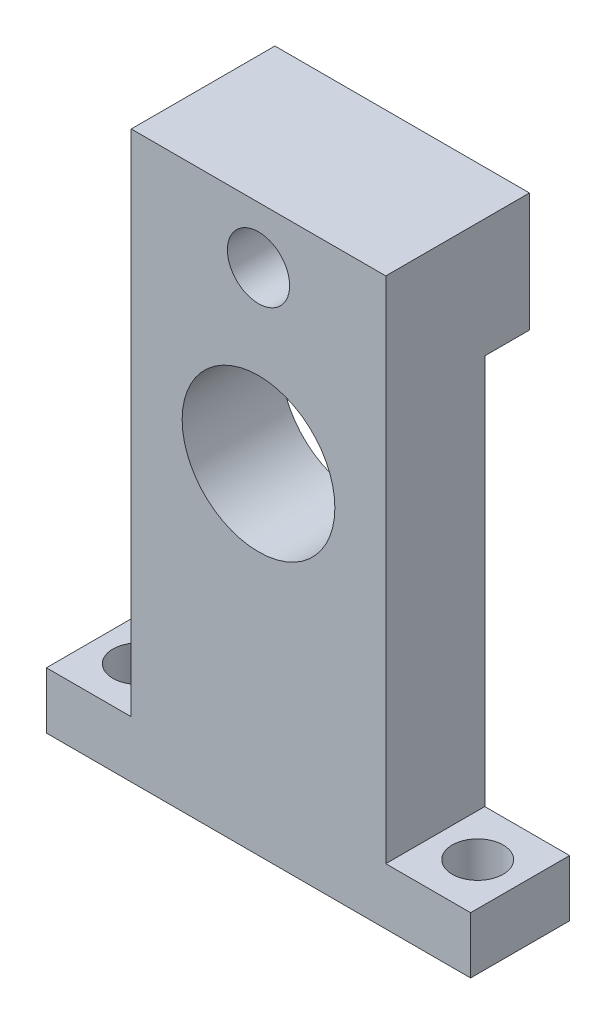
ISO-10303-21;
HEADER;
FILE_DESCRIPTION(('STEP AP214'),'2;1');
FILE_NAME('part.step','',(''),(''),'','','');
FILE_SCHEMA(('AUTOMOTIVE_DESIGN { 1 0 10303 214 1 1 1 1 }'));
ENDSEC;
DATA;
#1=APPLICATION_CONTEXT('core data for automotive mechanical design processes');
#2=APPLICATION_PROTOCOL_DEFINITION('international standard','automotive_design',2000,#1);
#3=PRODUCT_CONTEXT('',#1,'mechanical');
#4=PRODUCT('Part','Part','',(#3));
#5=PRODUCT_RELATED_PRODUCT_CATEGORY('part','',(#4));
#6=PRODUCT_DEFINITION_FORMATION('','',#4);
#7=PRODUCT_DEFINITION_CONTEXT('part definition',#1,'design');
#8=PRODUCT_DEFINITION('design','',#6,#7);
#9=PRODUCT_DEFINITION_SHAPE('','',#8);
#10=(LENGTH_UNIT() NAMED_UNIT(*) SI_UNIT(.MILLI.,.METRE.));
#11=(NAMED_UNIT(*) PLANE_ANGLE_UNIT() SI_UNIT($,.RADIAN.));
#12=(NAMED_UNIT(*) SI_UNIT($,.STERADIAN.) SOLID_ANGLE_UNIT());
#13=UNCERTAINTY_MEASURE_WITH_UNIT(LENGTH_MEASURE(1.E-05),#10,'distance_accuracy_value','');
#14=(GEOMETRIC_REPRESENTATION_CONTEXT(3) GLOBAL_UNCERTAINTY_ASSIGNED_CONTEXT((#13)) GLOBAL_UNIT_ASSIGNED_CONTEXT((#10,
#11,#12)) REPRESENTATION_CONTEXT('',''));
#15=CARTESIAN_POINT('',(0.,0.,0.));
#16=DIRECTION('',(0.,0.,1.));
#17=DIRECTION('',(1.,0.,0.));
#18=AXIS2_PLACEMENT_3D('',#15,#16,#17);
#19=CARTESIAN_POINT('',(37.5,90.,-7.9));
#20=DIRECTION('',(0.,0.,1.));
#21=DIRECTION('',(1.,0.,0.));
#22=AXIS2_PLACEMENT_3D('',#19,#20,#21);
#23=CYLINDRICAL_SURFACE('',#22,5.5);
#24=CARTESIAN_POINT('',(37.5,90.,17.5));
#25=DIRECTION('',(0.,0.,-1.));
#26=DIRECTION('',(-1.,0.,0.));
#27=AXIS2_PLACEMENT_3D('',#24,#25,#26);
#28=CIRCLE('',#27,5.5);
#29=CARTESIAN_POINT('',(32.,90.,17.5));
#30=VERTEX_POINT('',#29);
#31=EDGE_CURVE('E172',#30,#30,#28,.T.);
#32=ORIENTED_EDGE('',*,*,#31,.F.);
#33=EDGE_LOOP('',(#32));
#34=FACE_BOUND('',#33,.T.);
#35=CARTESIAN_POINT('',(37.5,90.,-7.9));
#36=DIRECTION('',(0.,0.,1.));
#37=DIRECTION('',(1.,0.,0.));
#38=AXIS2_PLACEMENT_3D('',#35,#36,#37);
#39=CIRCLE('',#38,5.5);
#40=CARTESIAN_POINT('',(43.,90.,-7.9));
#41=VERTEX_POINT('',#40);
#42=EDGE_CURVE('E11',#41,#41,#39,.T.);
#43=ORIENTED_EDGE('',*,*,#42,.F.);
#44=EDGE_LOOP('',(#43));
#45=FACE_BOUND('',#44,.T.);
#46=ADVANCED_FACE('F17',(#34,#45),#23,.F.);
#47=CARTESIAN_POINT('',(0.,0.,-7.9));
#48=DIRECTION('',(0.,0.,-1.));
#49=DIRECTION('',(0.,-1.,0.));
#50=AXIS2_PLACEMENT_3D('',#47,#48,#49);
#51=PLANE('',#50);
#52=DIRECTION('',(-1.,0.,0.));
#53=VECTOR('',#52,1.);
#54=CARTESIAN_POINT('',(60.,79.,-7.9));
#55=LINE('',#54,#53);
#56=CARTESIAN_POINT('',(60.,79.,-7.9));
#57=VERTEX_POINT('',#56);
#58=CARTESIAN_POINT('',(15.,79.,-7.9));
#59=VERTEX_POINT('',#58);
#60=EDGE_CURVE('E27',#57,#59,#55,.T.);
#61=ORIENTED_EDGE('',*,*,#60,.T.);
#62=DIRECTION('',(0.,1.,0.));
#63=VECTOR('',#62,1.);
#64=CARTESIAN_POINT('',(15.,79.,-7.9));
#65=LINE('',#64,#63);
#66=CARTESIAN_POINT('',(15.,100.,-7.9));
#67=VERTEX_POINT('',#66);
#68=EDGE_CURVE('E272',#59,#67,#65,.T.);
#69=ORIENTED_EDGE('',*,*,#68,.T.);
#70=DIRECTION('',(1.,0.,0.));
#71=VECTOR('',#70,1.);
#72=CARTESIAN_POINT('',(15.,100.,-7.9));
#73=LINE('',#72,#71);
#74=CARTESIAN_POINT('',(60.,100.,-7.9));
#75=VERTEX_POINT('',#74);
#76=EDGE_CURVE('E213',#67,#75,#73,.T.);
#77=ORIENTED_EDGE('',*,*,#76,.T.);
#78=DIRECTION('',(0.,-1.,0.));
#79=VECTOR('',#78,1.);
#80=CARTESIAN_POINT('',(60.,100.,-7.9));
#81=LINE('',#80,#79);
#82=EDGE_CURVE('E196',#75,#57,#81,.T.);
#83=ORIENTED_EDGE('',*,*,#82,.T.);
#84=EDGE_LOOP('',(#61,#69,#77,#83));
#85=FACE_BOUND('',#84,.T.);
#86=ORIENTED_EDGE('',*,*,#42,.T.);
#87=EDGE_LOOP('',(#86));
#88=FACE_BOUND('',#87,.T.);
#89=ADVANCED_FACE('F335',(#85,#88),#51,.T.);
#90=CARTESIAN_POINT('',(60.,79.,-7.9));
#91=DIRECTION('',(0.,1.,0.));
#92=DIRECTION('',(1.,0.,0.));
#93=AXIS2_PLACEMENT_3D('',#90,#91,#92);
#94=PLANE('',#93);
#95=DIRECTION('',(-1.,0.,0.));
#96=VECTOR('',#95,1.);
#97=CARTESIAN_POINT('',(60.,79.,0.));
#98=LINE('',#97,#96);
#99=CARTESIAN_POINT('',(60.,79.,0.));
#100=VERTEX_POINT('',#99);
#101=CARTESIAN_POINT('',(15.,79.,0.));
#102=VERTEX_POINT('',#101);
#103=EDGE_CURVE('E181',#100,#102,#98,.T.);
#104=ORIENTED_EDGE('',*,*,#103,.T.);
#105=DIRECTION('',(0.,0.,1.));
#106=VECTOR('',#105,1.);
#107=CARTESIAN_POINT('',(15.,79.,-7.9));
#108=LINE('',#107,#106);
#109=EDGE_CURVE('E263',#59,#102,#108,.T.);
#110=ORIENTED_EDGE('',*,*,#109,.F.);
#111=ORIENTED_EDGE('',*,*,#60,.F.);
#112=DIRECTION('',(0.,0.,1.));
#113=VECTOR('',#112,1.);
#114=CARTESIAN_POINT('',(60.,79.,-7.9));
#115=LINE('',#114,#113);
#116=EDGE_CURVE('E254',#57,#100,#115,.T.);
#117=ORIENTED_EDGE('',*,*,#116,.T.);
#118=EDGE_LOOP('',(#104,#110,#111,#117));
#119=FACE_BOUND('',#118,.T.);
#120=ADVANCED_FACE('F340',(#119),#94,.F.);
#121=CARTESIAN_POINT('',(37.5,60.,17.5));
#122=DIRECTION('',(0.,0.,-1.));
#123=DIRECTION('',(-1.,0.,0.));
#124=AXIS2_PLACEMENT_3D('',#121,#122,#123);
#125=CYLINDRICAL_SURFACE('',#124,13.5);
#126=CARTESIAN_POINT('',(37.5,60.,17.5));
#127=DIRECTION('',(0.,0.,-1.));
#128=DIRECTION('',(-1.,0.,0.));
#129=AXIS2_PLACEMENT_3D('',#126,#127,#128);
#130=CIRCLE('',#129,13.5);
#131=CARTESIAN_POINT('',(24.,60.,17.5));
#132=VERTEX_POINT('',#131);
#133=EDGE_CURVE('E177',#132,#132,#130,.T.);
#134=ORIENTED_EDGE('',*,*,#133,.F.);
#135=EDGE_LOOP('',(#134));
#136=FACE_BOUND('',#135,.T.);
#137=CARTESIAN_POINT('',(37.5,60.,0.));
#138=DIRECTION('',(0.,0.,-1.));
#139=DIRECTION('',(-1.,0.,0.));
#140=AXIS2_PLACEMENT_3D('',#137,#138,#139);
#141=CIRCLE('',#140,13.5);
#142=CARTESIAN_POINT('',(24.,60.,0.));
#143=VERTEX_POINT('',#142);
#144=EDGE_CURVE('E187',#143,#143,#141,.T.);
#145=ORIENTED_EDGE('',*,*,#144,.T.);
#146=EDGE_LOOP('',(#145));
#147=FACE_BOUND('',#146,.T.);
#148=ADVANCED_FACE('F346',(#136,#147),#125,.F.);
#149=CARTESIAN_POINT('',(67.5,0.,8.75));
#150=DIRECTION('',(0.,1.,0.));
#151=DIRECTION('',(0.,0.,1.));
#152=AXIS2_PLACEMENT_3D('',#149,#150,#151);
#153=CYLINDRICAL_SURFACE('',#152,4.5);
#154=CARTESIAN_POINT('',(67.5,0.,8.75));
#155=DIRECTION('',(0.,1.,0.));
#156=DIRECTION('',(0.,0.,1.));
#157=AXIS2_PLACEMENT_3D('',#154,#155,#156);
#158=CIRCLE('',#157,4.5);
#159=CARTESIAN_POINT('',(67.5,0.,13.25));
#160=VERTEX_POINT('',#159);
#161=EDGE_CURVE('E201',#160,#160,#158,.T.);
#162=ORIENTED_EDGE('',*,*,#161,.F.);
#163=EDGE_LOOP('',(#162));
#164=FACE_BOUND('',#163,.T.);
#165=CARTESIAN_POINT('',(67.5,10.,8.75));
#166=DIRECTION('',(0.,1.,0.));
#167=DIRECTION('',(-1.,0.,0.));
#168=AXIS2_PLACEMENT_3D('',#165,#166,#167);
#169=CIRCLE('',#168,4.5);
#170=CARTESIAN_POINT('',(63.,10.,8.75));
#171=VERTEX_POINT('',#170);
#172=EDGE_CURVE('E142',#171,#171,#169,.T.);
#173=ORIENTED_EDGE('',*,*,#172,.T.);
#174=EDGE_LOOP('',(#173));
#175=FACE_BOUND('',#174,.T.);
#176=ADVANCED_FACE('F354',(#164,#175),#153,.F.);
#177=CARTESIAN_POINT('',(7.5,0.,8.75));
#178=DIRECTION('',(0.,1.,0.));
#179=DIRECTION('',(0.,0.,1.));
#180=AXIS2_PLACEMENT_3D('',#177,#178,#179);
#181=CYLINDRICAL_SURFACE('',#180,4.5);
#182=CARTESIAN_POINT('',(7.5,0.,8.75));
#183=DIRECTION('',(0.,1.,0.));
#184=DIRECTION('',(0.,0.,1.));
#185=AXIS2_PLACEMENT_3D('',#182,#183,#184);
#186=CIRCLE('',#185,4.5);
#187=CARTESIAN_POINT('',(7.5,0.,13.25));
#188=VERTEX_POINT('',#187);
#189=EDGE_CURVE('E197',#188,#188,#186,.T.);
#190=ORIENTED_EDGE('',*,*,#189,.F.);
#191=EDGE_LOOP('',(#190));
#192=FACE_BOUND('',#191,.T.);
#193=CARTESIAN_POINT('',(7.5,10.,8.75));
#194=DIRECTION('',(0.,1.,0.));
#195=DIRECTION('',(-1.,0.,0.));
#196=AXIS2_PLACEMENT_3D('',#193,#194,#195);
#197=CIRCLE('',#196,4.5);
#198=CARTESIAN_POINT('',(3.,10.,8.75));
#199=VERTEX_POINT('',#198);
#200=EDGE_CURVE('E230',#199,#199,#197,.T.);
#201=ORIENTED_EDGE('',*,*,#200,.T.);
#202=EDGE_LOOP('',(#201));
#203=FACE_BOUND('',#202,.T.);
#204=ADVANCED_FACE('F351',(#192,#203),#181,.F.);
#205=CARTESIAN_POINT('',(0.,0.,0.));
#206=DIRECTION('',(0.,0.,-1.));
#207=DIRECTION('',(0.,-1.,0.));
#208=AXIS2_PLACEMENT_3D('',#205,#206,#207);
#209=PLANE('',#208);
#210=ORIENTED_EDGE('',*,*,#144,.F.);
#211=EDGE_LOOP('',(#210));
#212=FACE_BOUND('',#211,.T.);
#213=ORIENTED_EDGE('',*,*,#103,.F.);
#214=DIRECTION('',(0.,-1.,0.));
#215=VECTOR('',#214,1.);
#216=CARTESIAN_POINT('',(60.,100.,0.));
#217=LINE('',#216,#215);
#218=CARTESIAN_POINT('',(60.,10.,0.));
#219=VERTEX_POINT('',#218);
#220=EDGE_CURVE('E212',#100,#219,#217,.T.);
#221=ORIENTED_EDGE('',*,*,#220,.T.);
#222=DIRECTION('',(1.,0.,0.));
#223=VECTOR('',#222,1.);
#224=CARTESIAN_POINT('',(60.,10.,0.));
#225=LINE('',#224,#223);
#226=CARTESIAN_POINT('',(75.,10.,0.));
#227=VERTEX_POINT('',#226);
#228=EDGE_CURVE('E225',#219,#227,#225,.T.);
#229=ORIENTED_EDGE('',*,*,#228,.T.);
#230=DIRECTION('',(0.,-1.,0.));
#231=VECTOR('',#230,1.);
#232=CARTESIAN_POINT('',(75.,10.,0.));
#233=LINE('',#232,#231);
#234=CARTESIAN_POINT('',(75.,0.,0.));
#235=VERTEX_POINT('',#234);
#236=EDGE_CURVE('E97',#227,#235,#233,.T.);
#237=ORIENTED_EDGE('',*,*,#236,.T.);
#238=DIRECTION('',(-1.,0.,0.));
#239=VECTOR('',#238,1.);
#240=CARTESIAN_POINT('',(75.,0.,0.));
#241=LINE('',#240,#239);
#242=CARTESIAN_POINT('',(0.,0.,0.));
#243=VERTEX_POINT('',#242);
#244=EDGE_CURVE('E200',#235,#243,#241,.T.);
#245=ORIENTED_EDGE('',*,*,#244,.T.);
#246=DIRECTION('',(0.,1.,0.));
#247=VECTOR('',#246,1.);
#248=CARTESIAN_POINT('',(0.,0.,0.));
#249=LINE('',#248,#247);
#250=CARTESIAN_POINT('',(0.,10.,0.));
#251=VERTEX_POINT('',#250);
#252=EDGE_CURVE('E82',#243,#251,#249,.T.);
#253=ORIENTED_EDGE('',*,*,#252,.T.);
#254=DIRECTION('',(1.,0.,0.));
#255=VECTOR('',#254,1.);
#256=CARTESIAN_POINT('',(0.,10.,0.));
#257=LINE('',#256,#255);
#258=CARTESIAN_POINT('',(15.,10.,0.));
#259=VERTEX_POINT('',#258);
#260=EDGE_CURVE('E226',#251,#259,#257,.T.);
#261=ORIENTED_EDGE('',*,*,#260,.T.);
#262=DIRECTION('',(0.,1.,0.));
#263=VECTOR('',#262,1.);
#264=CARTESIAN_POINT('',(15.,10.,0.));
#265=LINE('',#264,#263);
#266=EDGE_CURVE('E218',#259,#102,#265,.T.);
#267=ORIENTED_EDGE('',*,*,#266,.T.);
#268=EDGE_LOOP('',(#213,#221,#229,#237,#245,#253,#261,#267));
#269=FACE_BOUND('',#268,.T.);
#270=ADVANCED_FACE('F251',(#212,#269),#209,.T.);
#271=CARTESIAN_POINT('',(0.,0.,17.5));
#272=DIRECTION('',(0.,0.,-1.));
#273=DIRECTION('',(0.,-1.,0.));
#274=AXIS2_PLACEMENT_3D('',#271,#272,#273);
#275=PLANE('',#274);
#276=DIRECTION('',(-1.,0.,0.));
#277=VECTOR('',#276,1.);
#278=CARTESIAN_POINT('',(75.,0.,17.5));
#279=LINE('',#278,#277);
#280=CARTESIAN_POINT('',(75.,0.,17.5));
#281=VERTEX_POINT('',#280);
#282=CARTESIAN_POINT('',(0.,0.,17.5));
#283=VERTEX_POINT('',#282);
#284=EDGE_CURVE('E278',#281,#283,#279,.T.);
#285=ORIENTED_EDGE('',*,*,#284,.F.);
#286=DIRECTION('',(0.,-1.,0.));
#287=VECTOR('',#286,1.);
#288=CARTESIAN_POINT('',(75.,10.,17.5));
#289=LINE('',#288,#287);
#290=CARTESIAN_POINT('',(75.,10.,17.5));
#291=VERTEX_POINT('',#290);
#292=EDGE_CURVE('E189',#291,#281,#289,.T.);
#293=ORIENTED_EDGE('',*,*,#292,.F.);
#294=DIRECTION('',(1.,0.,0.));
#295=VECTOR('',#294,1.);
#296=CARTESIAN_POINT('',(60.,10.,17.5));
#297=LINE('',#296,#295);
#298=CARTESIAN_POINT('',(60.,10.,17.5));
#299=VERTEX_POINT('',#298);
#300=EDGE_CURVE('E235',#299,#291,#297,.T.);
#301=ORIENTED_EDGE('',*,*,#300,.F.);
#302=DIRECTION('',(0.,-1.,0.));
#303=VECTOR('',#302,1.);
#304=CARTESIAN_POINT('',(60.,100.,17.5));
#305=LINE('',#304,#303);
#306=CARTESIAN_POINT('',(60.,100.,17.5));
#307=VERTEX_POINT('',#306);
#308=EDGE_CURVE('E153',#307,#299,#305,.T.);
#309=ORIENTED_EDGE('',*,*,#308,.F.);
#310=DIRECTION('',(1.,0.,0.));
#311=VECTOR('',#310,1.);
#312=CARTESIAN_POINT('',(15.,100.,17.5));
#313=LINE('',#312,#311);
#314=CARTESIAN_POINT('',(15.,100.,17.5));
#315=VERTEX_POINT('',#314);
#316=EDGE_CURVE('E209',#315,#307,#313,.T.);
#317=ORIENTED_EDGE('',*,*,#316,.F.);
#318=DIRECTION('',(0.,1.,0.));
#319=VECTOR('',#318,1.);
#320=CARTESIAN_POINT('',(15.,10.,17.5));
#321=LINE('',#320,#319);
#322=CARTESIAN_POINT('',(15.,10.,17.5));
#323=VERTEX_POINT('',#322);
#324=EDGE_CURVE('E20',#323,#315,#321,.T.);
#325=ORIENTED_EDGE('',*,*,#324,.F.);
#326=DIRECTION('',(1.,0.,0.));
#327=VECTOR('',#326,1.);
#328=CARTESIAN_POINT('',(0.,10.,17.5));
#329=LINE('',#328,#327);
#330=CARTESIAN_POINT('',(0.,10.,17.5));
#331=VERTEX_POINT('',#330);
#332=EDGE_CURVE('E219',#331,#323,#329,.T.);
#333=ORIENTED_EDGE('',*,*,#332,.F.);
#334=DIRECTION('',(0.,1.,0.));
#335=VECTOR('',#334,1.);
#336=CARTESIAN_POINT('',(0.,0.,17.5));
#337=LINE('',#336,#335);
#338=EDGE_CURVE('E202',#283,#331,#337,.T.);
#339=ORIENTED_EDGE('',*,*,#338,.F.);
#340=EDGE_LOOP('',(#285,#293,#301,#309,#317,#325,#333,#339));
#341=FACE_BOUND('',#340,.T.);
#342=ORIENTED_EDGE('',*,*,#133,.T.);
#343=EDGE_LOOP('',(#342));
#344=FACE_BOUND('',#343,.T.);
#345=ORIENTED_EDGE('',*,*,#31,.T.);
#346=EDGE_LOOP('',(#345));
#347=FACE_BOUND('',#346,.T.);
#348=ADVANCED_FACE('F178',(#341,#344,#347),#275,.F.);
#349=CARTESIAN_POINT('',(75.,10.,17.5));
#350=DIRECTION('',(1.,0.,0.));
#351=DIRECTION('',(0.,-1.,0.));
#352=AXIS2_PLACEMENT_3D('',#349,#350,#351);
#353=PLANE('',#352);
#354=ORIENTED_EDGE('',*,*,#236,.F.);
#355=DIRECTION('',(0.,0.,-1.));
#356=VECTOR('',#355,1.);
#357=CARTESIAN_POINT('',(75.,10.,17.5));
#358=LINE('',#357,#356);
#359=EDGE_CURVE('E239',#291,#227,#358,.T.);
#360=ORIENTED_EDGE('',*,*,#359,.F.);
#361=ORIENTED_EDGE('',*,*,#292,.T.);
#362=DIRECTION('',(0.,0.,-1.));
#363=VECTOR('',#362,1.);
#364=CARTESIAN_POINT('',(75.,0.,17.5));
#365=LINE('',#364,#363);
#366=EDGE_CURVE('E271',#281,#235,#365,.T.);
#367=ORIENTED_EDGE('',*,*,#366,.T.);
#368=EDGE_LOOP('',(#354,#360,#361,#367));
#369=FACE_BOUND('',#368,.T.);
#370=ADVANCED_FACE('F319',(#369),#353,.T.);
#371=CARTESIAN_POINT('',(60.,10.,17.5));
#372=DIRECTION('',(0.,1.,0.));
#373=DIRECTION('',(1.,0.,0.));
#374=AXIS2_PLACEMENT_3D('',#371,#372,#373);
#375=PLANE('',#374);
#376=ORIENTED_EDGE('',*,*,#228,.F.);
#377=DIRECTION('',(0.,0.,-1.));
#378=VECTOR('',#377,1.);
#379=CARTESIAN_POINT('',(60.,10.,17.5));
#380=LINE('',#379,#378);
#381=EDGE_CURVE('E195',#299,#219,#380,.T.);
#382=ORIENTED_EDGE('',*,*,#381,.F.);
#383=ORIENTED_EDGE('',*,*,#300,.T.);
#384=ORIENTED_EDGE('',*,*,#359,.T.);
#385=EDGE_LOOP('',(#376,#382,#383,#384));
#386=FACE_BOUND('',#385,.T.);
#387=ORIENTED_EDGE('',*,*,#172,.F.);
#388=EDGE_LOOP('',(#387));
#389=FACE_BOUND('',#388,.T.);
#390=ADVANCED_FACE('F320',(#386,#389),#375,.T.);
#391=CARTESIAN_POINT('',(60.,100.,17.5));
#392=DIRECTION('',(1.,0.,0.));
#393=DIRECTION('',(0.,1.,0.));
#394=AXIS2_PLACEMENT_3D('',#391,#392,#393);
#395=PLANE('',#394);
#396=ORIENTED_EDGE('',*,*,#220,.F.);
#397=ORIENTED_EDGE('',*,*,#116,.F.);
#398=ORIENTED_EDGE('',*,*,#82,.F.);
#399=DIRECTION('',(0.,0.,-1.));
#400=VECTOR('',#399,1.);
#401=CARTESIAN_POINT('',(60.,100.,17.5));
#402=LINE('',#401,#400);
#403=EDGE_CURVE('E234',#307,#75,#402,.T.);
#404=ORIENTED_EDGE('',*,*,#403,.F.);
#405=ORIENTED_EDGE('',*,*,#308,.T.);
#406=ORIENTED_EDGE('',*,*,#381,.T.);
#407=EDGE_LOOP('',(#396,#397,#398,#404,#405,#406));
#408=FACE_BOUND('',#407,.T.);
#409=ADVANCED_FACE('F247',(#408),#395,.T.);
#410=CARTESIAN_POINT('',(15.,100.,17.5));
#411=DIRECTION('',(0.,1.,0.));
#412=DIRECTION('',(1.,0.,0.));
#413=AXIS2_PLACEMENT_3D('',#410,#411,#412);
#414=PLANE('',#413);
#415=ORIENTED_EDGE('',*,*,#403,.T.);
#416=ORIENTED_EDGE('',*,*,#76,.F.);
#417=DIRECTION('',(0.,0.,-1.));
#418=VECTOR('',#417,1.);
#419=CARTESIAN_POINT('',(15.,100.,17.5));
#420=LINE('',#419,#418);
#421=EDGE_CURVE('E275',#315,#67,#420,.T.);
#422=ORIENTED_EDGE('',*,*,#421,.F.);
#423=ORIENTED_EDGE('',*,*,#316,.T.);
#424=EDGE_LOOP('',(#415,#416,#422,#423));
#425=FACE_BOUND('',#424,.T.);
#426=ADVANCED_FACE('F329',(#425),#414,.T.);
#427=CARTESIAN_POINT('',(15.,10.,17.5));
#428=DIRECTION('',(-1.,0.,0.));
#429=DIRECTION('',(0.,1.,0.));
#430=AXIS2_PLACEMENT_3D('',#427,#428,#429);
#431=PLANE('',#430);
#432=ORIENTED_EDGE('',*,*,#266,.F.);
#433=DIRECTION('',(0.,0.,-1.));
#434=VECTOR('',#433,1.);
#435=CARTESIAN_POINT('',(15.,10.,17.5));
#436=LINE('',#435,#434);
#437=EDGE_CURVE('E214',#323,#259,#436,.T.);
#438=ORIENTED_EDGE('',*,*,#437,.F.);
#439=ORIENTED_EDGE('',*,*,#324,.T.);
#440=ORIENTED_EDGE('',*,*,#421,.T.);
#441=ORIENTED_EDGE('',*,*,#68,.F.);
#442=ORIENTED_EDGE('',*,*,#109,.T.);
#443=EDGE_LOOP('',(#432,#438,#439,#440,#441,#442));
#444=FACE_BOUND('',#443,.T.);
#445=ADVANCED_FACE('F310',(#444),#431,.T.);
#446=CARTESIAN_POINT('',(0.,10.,17.5));
#447=DIRECTION('',(0.,1.,0.));
#448=DIRECTION('',(1.,0.,0.));
#449=AXIS2_PLACEMENT_3D('',#446,#447,#448);
#450=PLANE('',#449);
#451=ORIENTED_EDGE('',*,*,#260,.F.);
#452=DIRECTION('',(0.,0.,-1.));
#453=VECTOR('',#452,1.);
#454=CARTESIAN_POINT('',(0.,10.,17.5));
#455=LINE('',#454,#453);
#456=EDGE_CURVE('E206',#331,#251,#455,.T.);
#457=ORIENTED_EDGE('',*,*,#456,.F.);
#458=ORIENTED_EDGE('',*,*,#332,.T.);
#459=ORIENTED_EDGE('',*,*,#437,.T.);
#460=EDGE_LOOP('',(#451,#457,#458,#459));
#461=FACE_BOUND('',#460,.T.);
#462=ORIENTED_EDGE('',*,*,#200,.F.);
#463=EDGE_LOOP('',(#462));
#464=FACE_BOUND('',#463,.T.);
#465=ADVANCED_FACE('F301',(#461,#464),#450,.T.);
#466=CARTESIAN_POINT('',(0.,0.,17.5));
#467=DIRECTION('',(-1.,0.,0.));
#468=DIRECTION('',(0.,0.,1.));
#469=AXIS2_PLACEMENT_3D('',#466,#467,#468);
#470=PLANE('',#469);
#471=ORIENTED_EDGE('',*,*,#252,.F.);
#472=DIRECTION('',(0.,0.,-1.));
#473=VECTOR('',#472,1.);
#474=CARTESIAN_POINT('',(0.,0.,17.5));
#475=LINE('',#474,#473);
#476=EDGE_CURVE('E282',#283,#243,#475,.T.);
#477=ORIENTED_EDGE('',*,*,#476,.F.);
#478=ORIENTED_EDGE('',*,*,#338,.T.);
#479=ORIENTED_EDGE('',*,*,#456,.T.);
#480=EDGE_LOOP('',(#471,#477,#478,#479));
#481=FACE_BOUND('',#480,.T.);
#482=ADVANCED_FACE('F312',(#481),#470,.T.);
#483=CARTESIAN_POINT('',(75.,0.,17.5));
#484=DIRECTION('',(0.,-1.,0.));
#485=DIRECTION('',(0.,0.,-1.));
#486=AXIS2_PLACEMENT_3D('',#483,#484,#485);
#487=PLANE('',#486);
#488=ORIENTED_EDGE('',*,*,#244,.F.);
#489=ORIENTED_EDGE('',*,*,#366,.F.);
#490=ORIENTED_EDGE('',*,*,#284,.T.);
#491=ORIENTED_EDGE('',*,*,#476,.T.);
#492=EDGE_LOOP('',(#488,#489,#490,#491));
#493=FACE_BOUND('',#492,.T.);
#494=ORIENTED_EDGE('',*,*,#189,.T.);
#495=EDGE_LOOP('',(#494));
#496=FACE_BOUND('',#495,.T.);
#497=ORIENTED_EDGE('',*,*,#161,.T.);
#498=EDGE_LOOP('',(#497));
#499=FACE_BOUND('',#498,.T.);
#500=ADVANCED_FACE('F317',(#493,#496,#499),#487,.T.);
#501=CLOSED_SHELL('',(#46,#89,#120,#148,#176,#204,#270,#348,#370,#390,#409,#426,#445,#465,#482,#500));
#502=MANIFOLD_SOLID_BREP('B1',#501);
#503=ADVANCED_BREP_SHAPE_REPRESENTATION('',(#18,#502),#14);
#504=SHAPE_DEFINITION_REPRESENTATION(#9,#503);
ENDSEC;
END-ISO-10303-21;
